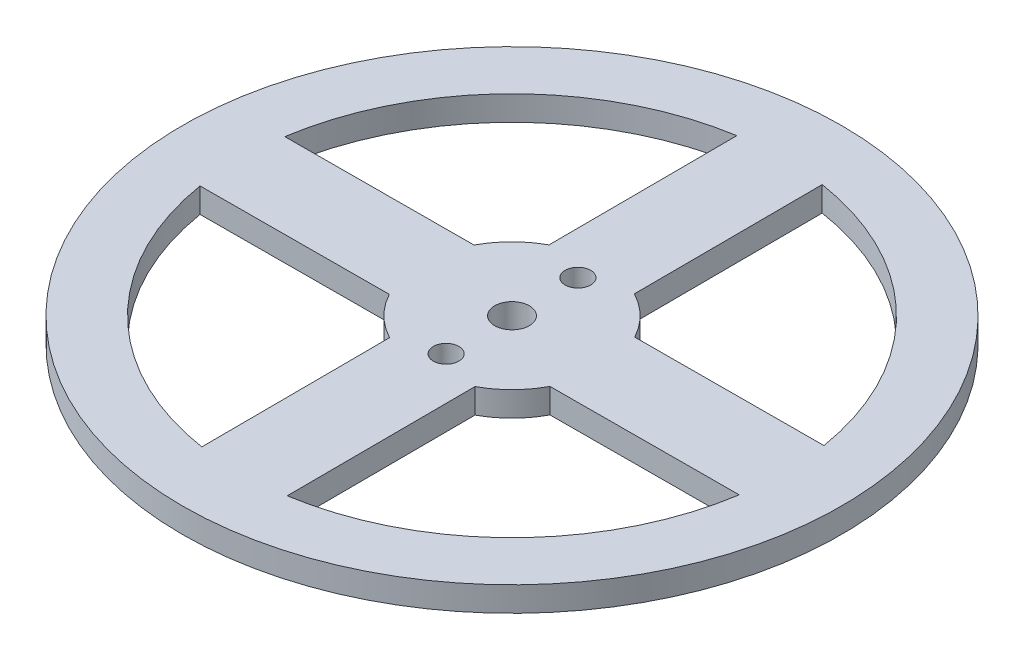
ISO-10303-21;
HEADER;
FILE_DESCRIPTION(('STEP AP214'),'2;1');
FILE_NAME('part.step','',(''),(''),'','','');
FILE_SCHEMA(('AUTOMOTIVE_DESIGN { 1 0 10303 214 1 1 1 1 }'));
ENDSEC;
DATA;
#1=APPLICATION_CONTEXT('core data for automotive mechanical design processes');
#2=APPLICATION_PROTOCOL_DEFINITION('international standard','automotive_design',2000,#1);
#3=PRODUCT_CONTEXT('',#1,'mechanical');
#4=PRODUCT('Part','Part','',(#3));
#5=PRODUCT_RELATED_PRODUCT_CATEGORY('part','',(#4));
#6=PRODUCT_DEFINITION_FORMATION('','',#4);
#7=PRODUCT_DEFINITION_CONTEXT('part definition',#1,'design');
#8=PRODUCT_DEFINITION('design','',#6,#7);
#9=PRODUCT_DEFINITION_SHAPE('','',#8);
#10=(LENGTH_UNIT() NAMED_UNIT(*) SI_UNIT(.MILLI.,.METRE.));
#11=(NAMED_UNIT(*) PLANE_ANGLE_UNIT() SI_UNIT($,.RADIAN.));
#12=(NAMED_UNIT(*) SI_UNIT($,.STERADIAN.) SOLID_ANGLE_UNIT());
#13=UNCERTAINTY_MEASURE_WITH_UNIT(LENGTH_MEASURE(1.E-05),#10,'distance_accuracy_value','');
#14=(GEOMETRIC_REPRESENTATION_CONTEXT(3) GLOBAL_UNCERTAINTY_ASSIGNED_CONTEXT((#13)) GLOBAL_UNIT_ASSIGNED_CONTEXT((#10,
#11,#12)) REPRESENTATION_CONTEXT('',''));
#15=CARTESIAN_POINT('',(0.,0.,0.));
#16=DIRECTION('',(0.,0.,1.));
#17=DIRECTION('',(1.,0.,0.));
#18=AXIS2_PLACEMENT_3D('',#15,#16,#17);
#19=CARTESIAN_POINT('',(0.,3.,0.));
#20=DIRECTION('',(0.,1.,0.));
#21=DIRECTION('',(0.,0.,1.));
#22=AXIS2_PLACEMENT_3D('',#19,#20,#21);
#23=PLANE('',#22);
#24=CARTESIAN_POINT('',(0.,3.,0.));
#25=DIRECTION('',(0.,1.,0.));
#26=DIRECTION('',(0.,0.,1.));
#27=AXIS2_PLACEMENT_3D('',#24,#25,#26);
#28=CIRCLE('',#27,2.1);
#29=CARTESIAN_POINT('',(0.,3.,2.1));
#30=VERTEX_POINT('',#29);
#31=EDGE_CURVE('E231',#30,#30,#28,.T.);
#32=ORIENTED_EDGE('',*,*,#31,.F.);
#33=EDGE_LOOP('',(#32));
#34=FACE_BOUND('',#33,.T.);
#35=CARTESIAN_POINT('',(0.,3.,8.));
#36=DIRECTION('',(0.,1.,0.));
#37=DIRECTION('',(0.,0.,1.));
#38=AXIS2_PLACEMENT_3D('',#35,#36,#37);
#39=CIRCLE('',#38,1.55);
#40=CARTESIAN_POINT('',(0.,3.,9.55));
#41=VERTEX_POINT('',#40);
#42=EDGE_CURVE('E241',#41,#41,#39,.T.);
#43=ORIENTED_EDGE('',*,*,#42,.F.);
#44=EDGE_LOOP('',(#43));
#45=FACE_BOUND('',#44,.T.);
#46=CARTESIAN_POINT('',(0.,3.,-8.));
#47=DIRECTION('',(0.,1.,0.));
#48=DIRECTION('',(0.,0.,1.));
#49=AXIS2_PLACEMENT_3D('',#46,#47,#48);
#50=CIRCLE('',#49,1.55);
#51=CARTESIAN_POINT('',(0.,3.,-6.45));
#52=VERTEX_POINT('',#51);
#53=EDGE_CURVE('E244',#52,#52,#50,.T.);
#54=ORIENTED_EDGE('',*,*,#53,.F.);
#55=EDGE_LOOP('',(#54));
#56=FACE_BOUND('',#55,.T.);
#57=CARTESIAN_POINT('',(0.,3.,0.));
#58=DIRECTION('',(0.,1.,0.));
#59=DIRECTION('',(0.,0.,1.));
#60=AXIS2_PLACEMENT_3D('',#57,#58,#59);
#61=CIRCLE('',#60,40.);
#62=CARTESIAN_POINT('',(0.,3.,40.));
#63=VERTEX_POINT('',#62);
#64=EDGE_CURVE('E248',#63,#63,#61,.T.);
#65=ORIENTED_EDGE('',*,*,#64,.T.);
#66=EDGE_LOOP('',(#65));
#67=FACE_BOUND('',#66,.T.);
#68=DIRECTION('',(0.00379993900092809,0.,0.999992780205732));
#69=VECTOR('',#68,1.);
#70=CARTESIAN_POINT('',(-5.16230007531392,3.,0.0196165670182575));
#71=LINE('',#70,#69);
#72=CARTESIAN_POINT('',(-5.28615420503817,3.,-32.5738633527028));
#73=VERTEX_POINT('',#72);
#74=CARTESIAN_POINT('',(-5.19921042893078,3.,-9.69372017935825));
#75=VERTEX_POINT('',#74);
#76=EDGE_CURVE('E219',#73,#75,#71,.T.);
#77=ORIENTED_EDGE('',*,*,#76,.T.);
#78=CARTESIAN_POINT('',(0.,3.,0.));
#79=DIRECTION('',(0.,1.,0.));
#80=DIRECTION('',(0.,0.,1.));
#81=AXIS2_PLACEMENT_3D('',#78,#79,#80);
#82=CIRCLE('',#81,11.);
#83=CARTESIAN_POINT('',(-9.73295331339468,3.,-5.12538972169722));
#84=VERTEX_POINT('',#83);
#85=EDGE_CURVE('E210',#75,#84,#82,.T.);
#86=ORIENTED_EDGE('',*,*,#85,.T.);
#87=DIRECTION('',(-0.999992780205732,0.,0.00379993900092746));
#88=VECTOR('',#87,1.);
#89=CARTESIAN_POINT('',(-0.0196165670182548,3.,-5.16230007531407));
#90=LINE('',#89,#88);
#91=CARTESIAN_POINT('',(-32.6130964867393,3.,-5.03844594558984));
#92=VERTEX_POINT('',#91);
#93=EDGE_CURVE('E225',#84,#92,#90,.T.);
#94=ORIENTED_EDGE('',*,*,#93,.T.);
#95=CARTESIAN_POINT('',(0.,3.,0.));
#96=DIRECTION('',(0.,1.,0.));
#97=DIRECTION('',(0.,0.,1.));
#98=AXIS2_PLACEMENT_3D('',#95,#96,#97);
#99=CIRCLE('',#98,33.);
#100=EDGE_CURVE('E222',#73,#92,#99,.T.);
#101=ORIENTED_EDGE('',*,*,#100,.F.);
#102=EDGE_LOOP('',(#77,#86,#94,#101));
#103=FACE_BOUND('',#102,.T.);
#104=DIRECTION('',(-0.999992780205732,0.,0.00379993900092746));
#105=VECTOR('',#104,1.);
#106=CARTESIAN_POINT('',(-0.0196165670182548,3.,-5.16230007531407));
#107=LINE('',#106,#105);
#108=CARTESIAN_POINT('',(32.5738633527028,3.,-5.2861542050383));
#109=VERTEX_POINT('',#108);
#110=CARTESIAN_POINT('',(9.69372017935817,3.,-5.19921042893093));
#111=VERTEX_POINT('',#110);
#112=EDGE_CURVE('E198',#109,#111,#107,.T.);
#113=ORIENTED_EDGE('',*,*,#112,.T.);
#114=CARTESIAN_POINT('',(0.,3.,0.));
#115=DIRECTION('',(0.,1.,0.));
#116=DIRECTION('',(0.,0.,1.));
#117=AXIS2_PLACEMENT_3D('',#114,#115,#116);
#118=CIRCLE('',#117,11.);
#119=CARTESIAN_POINT('',(5.12538972169719,3.,-9.73295331339469));
#120=VERTEX_POINT('',#119);
#121=EDGE_CURVE('E189',#111,#120,#118,.T.);
#122=ORIENTED_EDGE('',*,*,#121,.T.);
#123=DIRECTION('',(0.00379993900092764,0.,0.999992780205732));
#124=VECTOR('',#123,1.);
#125=CARTESIAN_POINT('',(5.16230007531405,3.,-0.0196165670182557));
#126=LINE('',#125,#124);
#127=CARTESIAN_POINT('',(5.03844594558982,3.,-32.6130964867393));
#128=VERTEX_POINT('',#127);
#129=EDGE_CURVE('E204',#128,#120,#126,.T.);
#130=ORIENTED_EDGE('',*,*,#129,.F.);
#131=CARTESIAN_POINT('',(0.,3.,0.));
#132=DIRECTION('',(0.,1.,0.));
#133=DIRECTION('',(0.,0.,1.));
#134=AXIS2_PLACEMENT_3D('',#131,#132,#133);
#135=CIRCLE('',#134,33.);
#136=EDGE_CURVE('E201',#109,#128,#135,.T.);
#137=ORIENTED_EDGE('',*,*,#136,.F.);
#138=EDGE_LOOP('',(#113,#122,#130,#137));
#139=FACE_BOUND('',#138,.T.);
#140=DIRECTION('',(0.00379993900092764,0.,0.999992780205732));
#141=VECTOR('',#140,1.);
#142=CARTESIAN_POINT('',(5.16230007531405,3.,-0.0196165670182557));
#143=LINE('',#142,#141);
#144=CARTESIAN_POINT('',(5.19921042893091,3.,9.69372017935818));
#145=VERTEX_POINT('',#144);
#146=CARTESIAN_POINT('',(5.28615420503829,3.,32.5738633527028));
#147=VERTEX_POINT('',#146);
#148=EDGE_CURVE('E177',#145,#147,#143,.T.);
#149=ORIENTED_EDGE('',*,*,#148,.F.);
#150=CARTESIAN_POINT('',(0.,3.,0.));
#151=DIRECTION('',(0.,1.,0.));
#152=DIRECTION('',(0.,0.,1.));
#153=AXIS2_PLACEMENT_3D('',#150,#151,#152);
#154=CIRCLE('',#153,11.);
#155=CARTESIAN_POINT('',(9.73295331339466,3.,5.12538972169725));
#156=VERTEX_POINT('',#155);
#157=EDGE_CURVE('E172',#145,#156,#154,.T.);
#158=ORIENTED_EDGE('',*,*,#157,.T.);
#159=DIRECTION('',(-0.999992780205732,0.,0.00379993900092864));
#160=VECTOR('',#159,1.);
#161=CARTESIAN_POINT('',(0.0196165670182611,3.,5.16230007531412));
#162=LINE('',#161,#160);
#163=CARTESIAN_POINT('',(32.6130964867394,3.,5.03844594558985));
#164=VERTEX_POINT('',#163);
#165=EDGE_CURVE('E183',#164,#156,#162,.T.);
#166=ORIENTED_EDGE('',*,*,#165,.F.);
#167=CARTESIAN_POINT('',(0.,3.,0.));
#168=DIRECTION('',(0.,1.,0.));
#169=DIRECTION('',(0.,0.,1.));
#170=AXIS2_PLACEMENT_3D('',#167,#168,#169);
#171=CIRCLE('',#170,33.);
#172=EDGE_CURVE('E180',#147,#164,#171,.T.);
#173=ORIENTED_EDGE('',*,*,#172,.F.);
#174=EDGE_LOOP('',(#149,#158,#166,#173));
#175=FACE_BOUND('',#174,.T.);
#176=DIRECTION('',(-0.999992780205732,0.,0.00379993900092864));
#177=VECTOR('',#176,1.);
#178=CARTESIAN_POINT('',(0.0196165670182611,3.,5.16230007531412));
#179=LINE('',#178,#177);
#180=CARTESIAN_POINT('',(-9.69372017935814,3.,5.19921042893099));
#181=VERTEX_POINT('',#180);
#182=CARTESIAN_POINT('',(-32.5738633527028,3.,5.28615420503839));
#183=VERTEX_POINT('',#182);
#184=EDGE_CURVE('E160',#181,#183,#179,.T.);
#185=ORIENTED_EDGE('',*,*,#184,.F.);
#186=CARTESIAN_POINT('',(0.,3.,0.));
#187=DIRECTION('',(0.,1.,0.));
#188=DIRECTION('',(0.,0.,1.));
#189=AXIS2_PLACEMENT_3D('',#186,#187,#188);
#190=CIRCLE('',#189,11.);
#191=CARTESIAN_POINT('',(-5.12538972169705,3.,9.73295331339477));
#192=VERTEX_POINT('',#191);
#193=EDGE_CURVE('E51',#181,#192,#190,.T.);
#194=ORIENTED_EDGE('',*,*,#193,.T.);
#195=DIRECTION('',(0.00379993900092809,0.,0.999992780205732));
#196=VECTOR('',#195,1.);
#197=CARTESIAN_POINT('',(-5.16230007531392,3.,0.0196165670182575));
#198=LINE('',#197,#196);
#199=CARTESIAN_POINT('',(-5.03844594558966,3.,32.6130964867394));
#200=VERTEX_POINT('',#199);
#201=EDGE_CURVE('E165',#192,#200,#198,.T.);
#202=ORIENTED_EDGE('',*,*,#201,.T.);
#203=CARTESIAN_POINT('',(0.,3.,0.));
#204=DIRECTION('',(0.,1.,0.));
#205=DIRECTION('',(0.,0.,1.));
#206=AXIS2_PLACEMENT_3D('',#203,#204,#205);
#207=CIRCLE('',#206,33.);
#208=EDGE_CURVE('E151',#183,#200,#207,.T.);
#209=ORIENTED_EDGE('',*,*,#208,.F.);
#210=EDGE_LOOP('',(#185,#194,#202,#209));
#211=FACE_BOUND('',#210,.T.);
#212=ADVANCED_FACE('F36',(#34,#45,#56,#67,#103,#139,#175,#211),#23,.T.);
#213=CARTESIAN_POINT('',(0.,0.,0.));
#214=DIRECTION('',(0.,1.,0.));
#215=DIRECTION('',(0.,0.,1.));
#216=AXIS2_PLACEMENT_3D('',#213,#214,#215);
#217=PLANE('',#216);
#218=CARTESIAN_POINT('',(0.,0.,0.));
#219=DIRECTION('',(0.,1.,0.));
#220=DIRECTION('',(0.,0.,1.));
#221=AXIS2_PLACEMENT_3D('',#218,#219,#220);
#222=CIRCLE('',#221,11.);
#223=CARTESIAN_POINT('',(5.19921042893091,0.,9.69372017935818));
#224=VERTEX_POINT('',#223);
#225=CARTESIAN_POINT('',(9.73295331339466,0.,5.12538972169725));
#226=VERTEX_POINT('',#225);
#227=EDGE_CURVE('E289',#224,#226,#222,.T.);
#228=ORIENTED_EDGE('',*,*,#227,.F.);
#229=DIRECTION('',(0.00379993900092764,0.,0.999992780205732));
#230=VECTOR('',#229,1.);
#231=CARTESIAN_POINT('',(5.16230007531405,0.,-0.0196165670182557));
#232=LINE('',#231,#230);
#233=CARTESIAN_POINT('',(5.28615420503829,0.,32.5738633527029));
#234=VERTEX_POINT('',#233);
#235=EDGE_CURVE('E280',#224,#234,#232,.T.);
#236=ORIENTED_EDGE('',*,*,#235,.T.);
#237=CARTESIAN_POINT('',(0.,0.,0.));
#238=DIRECTION('',(0.,1.,0.));
#239=DIRECTION('',(0.,0.,1.));
#240=AXIS2_PLACEMENT_3D('',#237,#238,#239);
#241=CIRCLE('',#240,33.);
#242=CARTESIAN_POINT('',(32.6130964867394,0.,5.03844594558985));
#243=VERTEX_POINT('',#242);
#244=EDGE_CURVE('E283',#234,#243,#241,.T.);
#245=ORIENTED_EDGE('',*,*,#244,.T.);
#246=DIRECTION('',(-0.999992780205732,0.,0.00379993900092864));
#247=VECTOR('',#246,1.);
#248=CARTESIAN_POINT('',(0.0196165670182611,0.,5.16230007531412));
#249=LINE('',#248,#247);
#250=EDGE_CURVE('E286',#243,#226,#249,.T.);
#251=ORIENTED_EDGE('',*,*,#250,.T.);
#252=EDGE_LOOP('',(#228,#236,#245,#251));
#253=FACE_BOUND('',#252,.T.);
#254=CARTESIAN_POINT('',(0.,0.,0.));
#255=DIRECTION('',(0.,1.,0.));
#256=DIRECTION('',(0.,0.,1.));
#257=AXIS2_PLACEMENT_3D('',#254,#255,#256);
#258=CIRCLE('',#257,11.);
#259=CARTESIAN_POINT('',(-5.19921042893078,0.,-9.69372017935825));
#260=VERTEX_POINT('',#259);
#261=CARTESIAN_POINT('',(-9.73295331339468,0.,-5.12538972169722));
#262=VERTEX_POINT('',#261);
#263=EDGE_CURVE('E268',#260,#262,#258,.T.);
#264=ORIENTED_EDGE('',*,*,#263,.F.);
#265=DIRECTION('',(0.00379993900092809,0.,0.999992780205732));
#266=VECTOR('',#265,1.);
#267=CARTESIAN_POINT('',(-5.16230007531392,0.,0.0196165670182575));
#268=LINE('',#267,#266);
#269=CARTESIAN_POINT('',(-5.28615420503817,0.,-32.5738633527028));
#270=VERTEX_POINT('',#269);
#271=EDGE_CURVE('E251',#270,#260,#268,.T.);
#272=ORIENTED_EDGE('',*,*,#271,.F.);
#273=CARTESIAN_POINT('',(0.,0.,0.));
#274=DIRECTION('',(0.,1.,0.));
#275=DIRECTION('',(0.,0.,1.));
#276=AXIS2_PLACEMENT_3D('',#273,#274,#275);
#277=CIRCLE('',#276,33.);
#278=CARTESIAN_POINT('',(-32.6130964867393,0.,-5.03844594558984));
#279=VERTEX_POINT('',#278);
#280=EDGE_CURVE('E263',#270,#279,#277,.T.);
#281=ORIENTED_EDGE('',*,*,#280,.T.);
#282=DIRECTION('',(-0.999992780205732,0.,0.00379993900092746));
#283=VECTOR('',#282,1.);
#284=CARTESIAN_POINT('',(-0.0196165670182548,0.,-5.16230007531407));
#285=LINE('',#284,#283);
#286=EDGE_CURVE('E266',#262,#279,#285,.T.);
#287=ORIENTED_EDGE('',*,*,#286,.F.);
#288=EDGE_LOOP('',(#264,#272,#281,#287));
#289=FACE_BOUND('',#288,.T.);
#290=CARTESIAN_POINT('',(0.,0.,0.));
#291=DIRECTION('',(0.,1.,0.));
#292=DIRECTION('',(0.,0.,1.));
#293=AXIS2_PLACEMENT_3D('',#290,#291,#292);
#294=CIRCLE('',#293,2.1);
#295=CARTESIAN_POINT('',(0.,0.,2.1));
#296=VERTEX_POINT('',#295);
#297=EDGE_CURVE('E240',#296,#296,#294,.T.);
#298=ORIENTED_EDGE('',*,*,#297,.T.);
#299=EDGE_LOOP('',(#298));
#300=FACE_BOUND('',#299,.T.);
#301=CARTESIAN_POINT('',(0.,0.,8.));
#302=DIRECTION('',(0.,1.,0.));
#303=DIRECTION('',(0.,0.,1.));
#304=AXIS2_PLACEMENT_3D('',#301,#302,#303);
#305=CIRCLE('',#304,1.55);
#306=CARTESIAN_POINT('',(0.,0.,9.55));
#307=VERTEX_POINT('',#306);
#308=EDGE_CURVE('E252',#307,#307,#305,.T.);
#309=ORIENTED_EDGE('',*,*,#308,.T.);
#310=EDGE_LOOP('',(#309));
#311=FACE_BOUND('',#310,.T.);
#312=CARTESIAN_POINT('',(0.,0.,-8.));
#313=DIRECTION('',(0.,1.,0.));
#314=DIRECTION('',(0.,0.,1.));
#315=AXIS2_PLACEMENT_3D('',#312,#313,#314);
#316=CIRCLE('',#315,1.55);
#317=CARTESIAN_POINT('',(0.,0.,-6.45));
#318=VERTEX_POINT('',#317);
#319=EDGE_CURVE('E255',#318,#318,#316,.T.);
#320=ORIENTED_EDGE('',*,*,#319,.T.);
#321=EDGE_LOOP('',(#320));
#322=FACE_BOUND('',#321,.T.);
#323=CARTESIAN_POINT('',(0.,0.,0.));
#324=DIRECTION('',(0.,1.,0.));
#325=DIRECTION('',(0.,0.,1.));
#326=AXIS2_PLACEMENT_3D('',#323,#324,#325);
#327=CIRCLE('',#326,40.);
#328=CARTESIAN_POINT('',(0.,0.,40.));
#329=VERTEX_POINT('',#328);
#330=EDGE_CURVE('E245',#329,#329,#327,.T.);
#331=ORIENTED_EDGE('',*,*,#330,.F.);
#332=EDGE_LOOP('',(#331));
#333=FACE_BOUND('',#332,.T.);
#334=CARTESIAN_POINT('',(0.,0.,0.));
#335=DIRECTION('',(0.,1.,0.));
#336=DIRECTION('',(0.,0.,1.));
#337=AXIS2_PLACEMENT_3D('',#334,#335,#336);
#338=CIRCLE('',#337,11.);
#339=CARTESIAN_POINT('',(9.69372017935817,0.,-5.19921042893093));
#340=VERTEX_POINT('',#339);
#341=CARTESIAN_POINT('',(5.12538972169719,0.,-9.73295331339469));
#342=VERTEX_POINT('',#341);
#343=EDGE_CURVE('E278',#340,#342,#338,.T.);
#344=ORIENTED_EDGE('',*,*,#343,.F.);
#345=DIRECTION('',(-0.999992780205732,0.,0.00379993900092746));
#346=VECTOR('',#345,1.);
#347=CARTESIAN_POINT('',(-0.0196165670182548,0.,-5.16230007531407));
#348=LINE('',#347,#346);
#349=CARTESIAN_POINT('',(32.5738633527028,0.,-5.2861542050383));
#350=VERTEX_POINT('',#349);
#351=EDGE_CURVE('E270',#350,#340,#348,.T.);
#352=ORIENTED_EDGE('',*,*,#351,.F.);
#353=CARTESIAN_POINT('',(0.,0.,0.));
#354=DIRECTION('',(0.,1.,0.));
#355=DIRECTION('',(0.,0.,1.));
#356=AXIS2_PLACEMENT_3D('',#353,#354,#355);
#357=CIRCLE('',#356,33.);
#358=CARTESIAN_POINT('',(5.03844594558982,0.,-32.6130964867393));
#359=VERTEX_POINT('',#358);
#360=EDGE_CURVE('E272',#350,#359,#357,.T.);
#361=ORIENTED_EDGE('',*,*,#360,.T.);
#362=DIRECTION('',(0.00379993900092764,0.,0.999992780205732));
#363=VECTOR('',#362,1.);
#364=CARTESIAN_POINT('',(5.16230007531405,0.,-0.0196165670182557));
#365=LINE('',#364,#363);
#366=EDGE_CURVE('E275',#359,#342,#365,.T.);
#367=ORIENTED_EDGE('',*,*,#366,.T.);
#368=EDGE_LOOP('',(#344,#352,#361,#367));
#369=FACE_BOUND('',#368,.T.);
#370=CARTESIAN_POINT('',(0.,0.,0.));
#371=DIRECTION('',(0.,1.,0.));
#372=DIRECTION('',(0.,0.,1.));
#373=AXIS2_PLACEMENT_3D('',#370,#371,#372);
#374=CIRCLE('',#373,11.);
#375=CARTESIAN_POINT('',(-9.69372017935814,0.,5.19921042893099));
#376=VERTEX_POINT('',#375);
#377=CARTESIAN_POINT('',(-5.12538972169705,0.,9.73295331339477));
#378=VERTEX_POINT('',#377);
#379=EDGE_CURVE('E11',#376,#378,#374,.T.);
#380=ORIENTED_EDGE('',*,*,#379,.F.);
#381=DIRECTION('',(-0.999992780205732,0.,0.00379993900092864));
#382=VECTOR('',#381,1.);
#383=CARTESIAN_POINT('',(0.0196165670182611,0.,5.16230007531412));
#384=LINE('',#383,#382);
#385=CARTESIAN_POINT('',(-32.5738633527028,0.,5.28615420503839));
#386=VERTEX_POINT('',#385);
#387=EDGE_CURVE('E291',#376,#386,#384,.T.);
#388=ORIENTED_EDGE('',*,*,#387,.T.);
#389=CARTESIAN_POINT('',(0.,0.,0.));
#390=DIRECTION('',(0.,1.,0.));
#391=DIRECTION('',(0.,0.,1.));
#392=AXIS2_PLACEMENT_3D('',#389,#390,#391);
#393=CIRCLE('',#392,33.);
#394=CARTESIAN_POINT('',(-5.03844594558966,0.,32.6130964867394));
#395=VERTEX_POINT('',#394);
#396=EDGE_CURVE('E154',#386,#395,#393,.T.);
#397=ORIENTED_EDGE('',*,*,#396,.T.);
#398=DIRECTION('',(0.00379993900092809,0.,0.999992780205732));
#399=VECTOR('',#398,1.);
#400=CARTESIAN_POINT('',(-5.16230007531392,0.,0.0196165670182575));
#401=LINE('',#400,#399);
#402=EDGE_CURVE('E44',#378,#395,#401,.T.);
#403=ORIENTED_EDGE('',*,*,#402,.F.);
#404=EDGE_LOOP('',(#380,#388,#397,#403));
#405=FACE_BOUND('',#404,.T.);
#406=ADVANCED_FACE('F299',(#253,#289,#300,#311,#322,#333,#369,#405),#217,.F.);
#407=CARTESIAN_POINT('',(0.,3.,-8.));
#408=DIRECTION('',(0.,-1.,0.));
#409=DIRECTION('',(0.,0.,-1.));
#410=AXIS2_PLACEMENT_3D('',#407,#408,#409);
#411=CYLINDRICAL_SURFACE('',#410,1.55);
#412=ORIENTED_EDGE('',*,*,#53,.T.);
#413=EDGE_LOOP('',(#412));
#414=FACE_BOUND('',#413,.T.);
#415=ORIENTED_EDGE('',*,*,#319,.F.);
#416=EDGE_LOOP('',(#415));
#417=FACE_BOUND('',#416,.T.);
#418=ADVANCED_FACE('F320',(#414,#417),#411,.F.);
#419=CARTESIAN_POINT('',(0.,3.,8.));
#420=DIRECTION('',(0.,-1.,0.));
#421=DIRECTION('',(0.,0.,-1.));
#422=AXIS2_PLACEMENT_3D('',#419,#420,#421);
#423=CYLINDRICAL_SURFACE('',#422,1.55);
#424=ORIENTED_EDGE('',*,*,#42,.T.);
#425=EDGE_LOOP('',(#424));
#426=FACE_BOUND('',#425,.T.);
#427=ORIENTED_EDGE('',*,*,#308,.F.);
#428=EDGE_LOOP('',(#427));
#429=FACE_BOUND('',#428,.T.);
#430=ADVANCED_FACE('F38',(#426,#429),#423,.F.);
#431=CARTESIAN_POINT('',(0.,3.,0.));
#432=DIRECTION('',(0.,-1.,0.));
#433=DIRECTION('',(0.,0.,-1.));
#434=AXIS2_PLACEMENT_3D('',#431,#432,#433);
#435=CYLINDRICAL_SURFACE('',#434,40.);
#436=ORIENTED_EDGE('',*,*,#64,.F.);
#437=EDGE_LOOP('',(#436));
#438=FACE_BOUND('',#437,.T.);
#439=ORIENTED_EDGE('',*,*,#330,.T.);
#440=EDGE_LOOP('',(#439));
#441=FACE_BOUND('',#440,.T.);
#442=ADVANCED_FACE('F329',(#438,#441),#435,.T.);
#443=CARTESIAN_POINT('',(0.,-7.,0.));
#444=DIRECTION('',(0.,1.,0.));
#445=DIRECTION('',(0.,0.,1.));
#446=AXIS2_PLACEMENT_3D('',#443,#444,#445);
#447=CYLINDRICAL_SURFACE('',#446,2.1);
#448=ORIENTED_EDGE('',*,*,#31,.T.);
#449=EDGE_LOOP('',(#448));
#450=FACE_BOUND('',#449,.T.);
#451=ORIENTED_EDGE('',*,*,#297,.F.);
#452=EDGE_LOOP('',(#451));
#453=FACE_BOUND('',#452,.T.);
#454=ADVANCED_FACE('F326',(#450,#453),#447,.F.);
#455=CARTESIAN_POINT('',(0.,-7.,0.));
#456=DIRECTION('',(0.,1.,0.));
#457=DIRECTION('',(0.,0.,1.));
#458=AXIS2_PLACEMENT_3D('',#455,#456,#457);
#459=CYLINDRICAL_SURFACE('',#458,11.);
#460=ORIENTED_EDGE('',*,*,#263,.T.);
#461=DIRECTION('',(0.,1.,0.));
#462=VECTOR('',#461,1.);
#463=CARTESIAN_POINT('',(-9.73295331339468,-7.,-5.12538972169722));
#464=LINE('',#463,#462);
#465=EDGE_CURVE('E229',#262,#84,#464,.T.);
#466=ORIENTED_EDGE('',*,*,#465,.T.);
#467=ORIENTED_EDGE('',*,*,#85,.F.);
#468=DIRECTION('',(0.,1.,0.));
#469=VECTOR('',#468,1.);
#470=CARTESIAN_POINT('',(-5.19921042893078,-7.,-9.69372017935825));
#471=LINE('',#470,#469);
#472=EDGE_CURVE('E228',#260,#75,#471,.T.);
#473=ORIENTED_EDGE('',*,*,#472,.F.);
#474=EDGE_LOOP('',(#460,#466,#467,#473));
#475=FACE_BOUND('',#474,.T.);
#476=ADVANCED_FACE('F382',(#475),#459,.T.);
#477=CARTESIAN_POINT('',(-0.0196165670182548,-7.,-5.16230007531407));
#478=DIRECTION('',(-0.00379993900092746,0.,-0.999992780205732));
#479=DIRECTION('',(-0.999992780205732,0.,0.00379993900092746));
#480=AXIS2_PLACEMENT_3D('',#477,#478,#479);
#481=PLANE('',#480);
#482=ORIENTED_EDGE('',*,*,#286,.T.);
#483=DIRECTION('',(0.,1.,0.));
#484=VECTOR('',#483,1.);
#485=CARTESIAN_POINT('',(-32.6130964867393,-7.,-5.03844594558984));
#486=LINE('',#485,#484);
#487=EDGE_CURVE('E232',#279,#92,#486,.T.);
#488=ORIENTED_EDGE('',*,*,#487,.T.);
#489=ORIENTED_EDGE('',*,*,#93,.F.);
#490=ORIENTED_EDGE('',*,*,#465,.F.);
#491=EDGE_LOOP('',(#482,#488,#489,#490));
#492=FACE_BOUND('',#491,.T.);
#493=ADVANCED_FACE('F378',(#492),#481,.T.);
#494=CARTESIAN_POINT('',(0.,-7.,0.));
#495=DIRECTION('',(0.,1.,0.));
#496=DIRECTION('',(0.,0.,1.));
#497=AXIS2_PLACEMENT_3D('',#494,#495,#496);
#498=CYLINDRICAL_SURFACE('',#497,33.);
#499=DIRECTION('',(0.,1.,0.));
#500=VECTOR('',#499,1.);
#501=CARTESIAN_POINT('',(-5.28615420503817,-7.,-32.5738633527028));
#502=LINE('',#501,#500);
#503=EDGE_CURVE('E234',#270,#73,#502,.T.);
#504=ORIENTED_EDGE('',*,*,#503,.T.);
#505=ORIENTED_EDGE('',*,*,#100,.T.);
#506=ORIENTED_EDGE('',*,*,#487,.F.);
#507=ORIENTED_EDGE('',*,*,#280,.F.);
#508=EDGE_LOOP('',(#504,#505,#506,#507));
#509=FACE_BOUND('',#508,.T.);
#510=ADVANCED_FACE('F381',(#509),#498,.F.);
#511=CARTESIAN_POINT('',(-5.16230007531392,-7.,0.0196165670182575));
#512=DIRECTION('',(-0.999992780205732,0.,0.00379993900092809));
#513=DIRECTION('',(0.00379993900092809,0.,0.999992780205732));
#514=AXIS2_PLACEMENT_3D('',#511,#512,#513);
#515=PLANE('',#514);
#516=ORIENTED_EDGE('',*,*,#271,.T.);
#517=ORIENTED_EDGE('',*,*,#472,.T.);
#518=ORIENTED_EDGE('',*,*,#76,.F.);
#519=ORIENTED_EDGE('',*,*,#503,.F.);
#520=EDGE_LOOP('',(#516,#517,#518,#519));
#521=FACE_BOUND('',#520,.T.);
#522=ADVANCED_FACE('F377',(#521),#515,.T.);
#523=CARTESIAN_POINT('',(0.,-7.,0.));
#524=DIRECTION('',(0.,1.,0.));
#525=DIRECTION('',(0.,0.,1.));
#526=AXIS2_PLACEMENT_3D('',#523,#524,#525);
#527=CYLINDRICAL_SURFACE('',#526,11.);
#528=ORIENTED_EDGE('',*,*,#343,.T.);
#529=DIRECTION('',(0.,1.,0.));
#530=VECTOR('',#529,1.);
#531=CARTESIAN_POINT('',(5.12538972169719,-7.,-9.73295331339469));
#532=LINE('',#531,#530);
#533=EDGE_CURVE('E208',#342,#120,#532,.T.);
#534=ORIENTED_EDGE('',*,*,#533,.T.);
#535=ORIENTED_EDGE('',*,*,#121,.F.);
#536=DIRECTION('',(0.,1.,0.));
#537=VECTOR('',#536,1.);
#538=CARTESIAN_POINT('',(9.69372017935817,-7.,-5.19921042893093));
#539=LINE('',#538,#537);
#540=EDGE_CURVE('E207',#340,#111,#539,.T.);
#541=ORIENTED_EDGE('',*,*,#540,.F.);
#542=EDGE_LOOP('',(#528,#534,#535,#541));
#543=FACE_BOUND('',#542,.T.);
#544=ADVANCED_FACE('F350',(#543),#527,.T.);
#545=CARTESIAN_POINT('',(5.16230007531405,-7.,-0.0196165670182557));
#546=DIRECTION('',(-0.999992780205732,0.,0.00379993900092764));
#547=DIRECTION('',(0.00379993900092764,0.,0.999992780205732));
#548=AXIS2_PLACEMENT_3D('',#545,#546,#547);
#549=PLANE('',#548);
#550=DIRECTION('',(0.,1.,0.));
#551=VECTOR('',#550,1.);
#552=CARTESIAN_POINT('',(5.03844594558982,-7.,-32.6130964867393));
#553=LINE('',#552,#551);
#554=EDGE_CURVE('E211',#359,#128,#553,.T.);
#555=ORIENTED_EDGE('',*,*,#554,.T.);
#556=ORIENTED_EDGE('',*,*,#129,.T.);
#557=ORIENTED_EDGE('',*,*,#533,.F.);
#558=ORIENTED_EDGE('',*,*,#366,.F.);
#559=EDGE_LOOP('',(#555,#556,#557,#558));
#560=FACE_BOUND('',#559,.T.);
#561=ADVANCED_FACE('F352',(#560),#549,.F.);
#562=CARTESIAN_POINT('',(0.,-7.,0.));
#563=DIRECTION('',(0.,1.,0.));
#564=DIRECTION('',(0.,0.,1.));
#565=AXIS2_PLACEMENT_3D('',#562,#563,#564);
#566=CYLINDRICAL_SURFACE('',#565,33.);
#567=DIRECTION('',(0.,1.,0.));
#568=VECTOR('',#567,1.);
#569=CARTESIAN_POINT('',(32.5738633527028,-7.,-5.2861542050383));
#570=LINE('',#569,#568);
#571=EDGE_CURVE('E213',#350,#109,#570,.T.);
#572=ORIENTED_EDGE('',*,*,#571,.T.);
#573=ORIENTED_EDGE('',*,*,#136,.T.);
#574=ORIENTED_EDGE('',*,*,#554,.F.);
#575=ORIENTED_EDGE('',*,*,#360,.F.);
#576=EDGE_LOOP('',(#572,#573,#574,#575));
#577=FACE_BOUND('',#576,.T.);
#578=ADVANCED_FACE('F363',(#577),#566,.F.);
#579=CARTESIAN_POINT('',(-0.0196165670182548,-7.,-5.16230007531407));
#580=DIRECTION('',(-0.00379993900092746,0.,-0.999992780205732));
#581=DIRECTION('',(-0.999992780205732,0.,0.00379993900092746));
#582=AXIS2_PLACEMENT_3D('',#579,#580,#581);
#583=PLANE('',#582);
#584=ORIENTED_EDGE('',*,*,#351,.T.);
#585=ORIENTED_EDGE('',*,*,#540,.T.);
#586=ORIENTED_EDGE('',*,*,#112,.F.);
#587=ORIENTED_EDGE('',*,*,#571,.F.);
#588=EDGE_LOOP('',(#584,#585,#586,#587));
#589=FACE_BOUND('',#588,.T.);
#590=ADVANCED_FACE('F360',(#589),#583,.T.);
#591=CARTESIAN_POINT('',(0.,-7.,0.));
#592=DIRECTION('',(0.,1.,0.));
#593=DIRECTION('',(0.,0.,1.));
#594=AXIS2_PLACEMENT_3D('',#591,#592,#593);
#595=CYLINDRICAL_SURFACE('',#594,11.);
#596=ORIENTED_EDGE('',*,*,#227,.T.);
#597=DIRECTION('',(0.,1.,0.));
#598=VECTOR('',#597,1.);
#599=CARTESIAN_POINT('',(9.73295331339466,-7.,5.12538972169725));
#600=LINE('',#599,#598);
#601=EDGE_CURVE('E187',#226,#156,#600,.T.);
#602=ORIENTED_EDGE('',*,*,#601,.T.);
#603=ORIENTED_EDGE('',*,*,#157,.F.);
#604=DIRECTION('',(0.,1.,0.));
#605=VECTOR('',#604,1.);
#606=CARTESIAN_POINT('',(5.19921042893091,-7.,9.69372017935818));
#607=LINE('',#606,#605);
#608=EDGE_CURVE('E186',#224,#145,#607,.T.);
#609=ORIENTED_EDGE('',*,*,#608,.F.);
#610=EDGE_LOOP('',(#596,#602,#603,#609));
#611=FACE_BOUND('',#610,.T.);
#612=ADVANCED_FACE('F370',(#611),#595,.T.);
#613=CARTESIAN_POINT('',(0.0196165670182611,-7.,5.16230007531412));
#614=DIRECTION('',(-0.00379993900092864,0.,-0.999992780205732));
#615=DIRECTION('',(-0.999992780205732,0.,0.00379993900092864));
#616=AXIS2_PLACEMENT_3D('',#613,#614,#615);
#617=PLANE('',#616);
#618=DIRECTION('',(0.,1.,0.));
#619=VECTOR('',#618,1.);
#620=CARTESIAN_POINT('',(32.6130964867394,-7.,5.03844594558985));
#621=LINE('',#620,#619);
#622=EDGE_CURVE('E190',#243,#164,#621,.T.);
#623=ORIENTED_EDGE('',*,*,#622,.T.);
#624=ORIENTED_EDGE('',*,*,#165,.T.);
#625=ORIENTED_EDGE('',*,*,#601,.F.);
#626=ORIENTED_EDGE('',*,*,#250,.F.);
#627=EDGE_LOOP('',(#623,#624,#625,#626));
#628=FACE_BOUND('',#627,.T.);
#629=ADVANCED_FACE('F494',(#628),#617,.F.);
#630=CARTESIAN_POINT('',(0.,-7.,0.));
#631=DIRECTION('',(0.,1.,0.));
#632=DIRECTION('',(0.,0.,1.));
#633=AXIS2_PLACEMENT_3D('',#630,#631,#632);
#634=CYLINDRICAL_SURFACE('',#633,33.);
#635=DIRECTION('',(0.,1.,0.));
#636=VECTOR('',#635,1.);
#637=CARTESIAN_POINT('',(5.28615420503829,-7.,32.5738633527028));
#638=LINE('',#637,#636);
#639=EDGE_CURVE('E192',#234,#147,#638,.T.);
#640=ORIENTED_EDGE('',*,*,#639,.T.);
#641=ORIENTED_EDGE('',*,*,#172,.T.);
#642=ORIENTED_EDGE('',*,*,#622,.F.);
#643=ORIENTED_EDGE('',*,*,#244,.F.);
#644=EDGE_LOOP('',(#640,#641,#642,#643));
#645=FACE_BOUND('',#644,.T.);
#646=ADVANCED_FACE('F309',(#645),#634,.F.);
#647=CARTESIAN_POINT('',(5.16230007531405,-7.,-0.0196165670182557));
#648=DIRECTION('',(-0.999992780205732,0.,0.00379993900092764));
#649=DIRECTION('',(0.00379993900092764,0.,0.999992780205732));
#650=AXIS2_PLACEMENT_3D('',#647,#648,#649);
#651=PLANE('',#650);
#652=ORIENTED_EDGE('',*,*,#608,.T.);
#653=ORIENTED_EDGE('',*,*,#148,.T.);
#654=ORIENTED_EDGE('',*,*,#639,.F.);
#655=ORIENTED_EDGE('',*,*,#235,.F.);
#656=EDGE_LOOP('',(#652,#653,#654,#655));
#657=FACE_BOUND('',#656,.T.);
#658=ADVANCED_FACE('F302',(#657),#651,.F.);
#659=CARTESIAN_POINT('',(0.,-7.,0.));
#660=DIRECTION('',(0.,1.,0.));
#661=DIRECTION('',(0.,0.,1.));
#662=AXIS2_PLACEMENT_3D('',#659,#660,#661);
#663=CYLINDRICAL_SURFACE('',#662,11.);
#664=ORIENTED_EDGE('',*,*,#379,.T.);
#665=DIRECTION('',(0.,1.,0.));
#666=VECTOR('',#665,1.);
#667=CARTESIAN_POINT('',(-5.12538972169705,-7.,9.73295331339477));
#668=LINE('',#667,#666);
#669=EDGE_CURVE('E170',#378,#192,#668,.T.);
#670=ORIENTED_EDGE('',*,*,#669,.T.);
#671=ORIENTED_EDGE('',*,*,#193,.F.);
#672=DIRECTION('',(0.,1.,0.));
#673=VECTOR('',#672,1.);
#674=CARTESIAN_POINT('',(-9.69372017935814,-7.,5.19921042893099));
#675=LINE('',#674,#673);
#676=EDGE_CURVE('E157',#376,#181,#675,.T.);
#677=ORIENTED_EDGE('',*,*,#676,.F.);
#678=EDGE_LOOP('',(#664,#670,#671,#677));
#679=FACE_BOUND('',#678,.T.);
#680=ADVANCED_FACE('F300',(#679),#663,.T.);
#681=CARTESIAN_POINT('',(-5.16230007531392,-7.,0.0196165670182575));
#682=DIRECTION('',(-0.999992780205732,0.,0.00379993900092809));
#683=DIRECTION('',(0.00379993900092809,0.,0.999992780205732));
#684=AXIS2_PLACEMENT_3D('',#681,#682,#683);
#685=PLANE('',#684);
#686=ORIENTED_EDGE('',*,*,#402,.T.);
#687=DIRECTION('',(0.,1.,0.));
#688=VECTOR('',#687,1.);
#689=CARTESIAN_POINT('',(-5.03844594558966,-7.,32.6130964867394));
#690=LINE('',#689,#688);
#691=EDGE_CURVE('E156',#395,#200,#690,.T.);
#692=ORIENTED_EDGE('',*,*,#691,.T.);
#693=ORIENTED_EDGE('',*,*,#201,.F.);
#694=ORIENTED_EDGE('',*,*,#669,.F.);
#695=EDGE_LOOP('',(#686,#692,#693,#694));
#696=FACE_BOUND('',#695,.T.);
#697=ADVANCED_FACE('F296',(#696),#685,.T.);
#698=CARTESIAN_POINT('',(0.,-7.,0.));
#699=DIRECTION('',(0.,1.,0.));
#700=DIRECTION('',(0.,0.,1.));
#701=AXIS2_PLACEMENT_3D('',#698,#699,#700);
#702=CYLINDRICAL_SURFACE('',#701,33.);
#703=DIRECTION('',(0.,1.,0.));
#704=VECTOR('',#703,1.);
#705=CARTESIAN_POINT('',(-32.5738633527028,-7.,5.28615420503839));
#706=LINE('',#705,#704);
#707=EDGE_CURVE('E59',#386,#183,#706,.T.);
#708=ORIENTED_EDGE('',*,*,#707,.T.);
#709=ORIENTED_EDGE('',*,*,#208,.T.);
#710=ORIENTED_EDGE('',*,*,#691,.F.);
#711=ORIENTED_EDGE('',*,*,#396,.F.);
#712=EDGE_LOOP('',(#708,#709,#710,#711));
#713=FACE_BOUND('',#712,.T.);
#714=ADVANCED_FACE('F148',(#713),#702,.F.);
#715=CARTESIAN_POINT('',(0.0196165670182611,-7.,5.16230007531412));
#716=DIRECTION('',(-0.00379993900092864,0.,-0.999992780205732));
#717=DIRECTION('',(-0.999992780205732,0.,0.00379993900092864));
#718=AXIS2_PLACEMENT_3D('',#715,#716,#717);
#719=PLANE('',#718);
#720=ORIENTED_EDGE('',*,*,#676,.T.);
#721=ORIENTED_EDGE('',*,*,#184,.T.);
#722=ORIENTED_EDGE('',*,*,#707,.F.);
#723=ORIENTED_EDGE('',*,*,#387,.F.);
#724=EDGE_LOOP('',(#720,#721,#722,#723));
#725=FACE_BOUND('',#724,.T.);
#726=ADVANCED_FACE('F161',(#725),#719,.F.);
#727=CLOSED_SHELL('',(#212,#406,#418,#430,#442,#454,#476,#493,#510,#522,#544,#561,#578,#590,
#612,#629,#646,#658,#680,#697,#714,#726));
#728=MANIFOLD_SOLID_BREP('B2',#727);
#729=ADVANCED_BREP_SHAPE_REPRESENTATION('',(#18,#728),#14);
#730=SHAPE_DEFINITION_REPRESENTATION(#9,#729);
ENDSEC;
END-ISO-10303-21;
